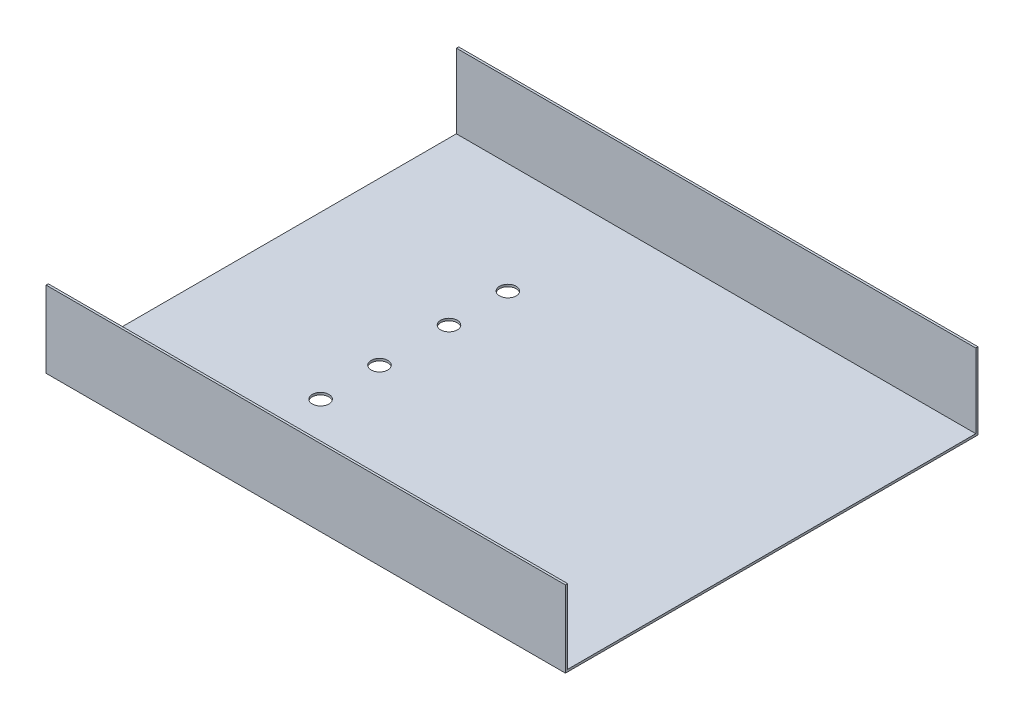
ISO-10303-21;
HEADER;
FILE_DESCRIPTION(('STEP AP214'),'2;1');
FILE_NAME('part.step','',(''),(''),'','','');
FILE_SCHEMA(('AUTOMOTIVE_DESIGN { 1 0 10303 214 1 1 1 1 }'));
ENDSEC;
DATA;
#1=APPLICATION_CONTEXT('core data for automotive mechanical design processes');
#2=APPLICATION_PROTOCOL_DEFINITION('international standard','automotive_design',2000,#1);
#3=PRODUCT_CONTEXT('',#1,'mechanical');
#4=PRODUCT('Part','Part','',(#3));
#5=PRODUCT_RELATED_PRODUCT_CATEGORY('part','',(#4));
#6=PRODUCT_DEFINITION_FORMATION('','',#4);
#7=PRODUCT_DEFINITION_CONTEXT('part definition',#1,'design');
#8=PRODUCT_DEFINITION('design','',#6,#7);
#9=PRODUCT_DEFINITION_SHAPE('','',#8);
#10=(LENGTH_UNIT() NAMED_UNIT(*) SI_UNIT(.MILLI.,.METRE.));
#11=(NAMED_UNIT(*) PLANE_ANGLE_UNIT() SI_UNIT($,.RADIAN.));
#12=(NAMED_UNIT(*) SI_UNIT($,.STERADIAN.) SOLID_ANGLE_UNIT());
#13=UNCERTAINTY_MEASURE_WITH_UNIT(LENGTH_MEASURE(1.E-05),#10,'distance_accuracy_value','');
#14=(GEOMETRIC_REPRESENTATION_CONTEXT(3) GLOBAL_UNCERTAINTY_ASSIGNED_CONTEXT((#13)) GLOBAL_UNIT_ASSIGNED_CONTEXT((#10,
#11,#12)) REPRESENTATION_CONTEXT('',''));
#15=CARTESIAN_POINT('',(0.,0.,0.));
#16=DIRECTION('',(0.,0.,1.));
#17=DIRECTION('',(1.,0.,0.));
#18=AXIS2_PLACEMENT_3D('',#15,#16,#17);
#19=CARTESIAN_POINT('',(140.,20.,0.));
#20=DIRECTION('',(0.,-1.,0.));
#21=DIRECTION('',(0.,0.,-1.));
#22=AXIS2_PLACEMENT_3D('',#19,#20,#21);
#23=PLANE('',#22);
#24=DIRECTION('',(-1.,0.,0.));
#25=VECTOR('',#24,1.);
#26=CARTESIAN_POINT('',(140.,20.,-110.));
#27=LINE('',#26,#25);
#28=CARTESIAN_POINT('',(140.,20.,-110.));
#29=VERTEX_POINT('',#28);
#30=CARTESIAN_POINT('',(0.,20.,-110.));
#31=VERTEX_POINT('',#30);
#32=EDGE_CURVE('E165',#29,#31,#27,.T.);
#33=ORIENTED_EDGE('',*,*,#32,.F.);
#34=DIRECTION('',(0.,0.,1.));
#35=VECTOR('',#34,1.);
#36=CARTESIAN_POINT('',(140.,20.,0.));
#37=LINE('',#36,#35);
#38=CARTESIAN_POINT('',(140.,20.,-110.6));
#39=VERTEX_POINT('',#38);
#40=EDGE_CURVE('E117',#39,#29,#37,.T.);
#41=ORIENTED_EDGE('',*,*,#40,.F.);
#42=DIRECTION('',(-1.,0.,0.));
#43=VECTOR('',#42,1.);
#44=CARTESIAN_POINT('',(140.,20.,-110.6));
#45=LINE('',#44,#43);
#46=CARTESIAN_POINT('',(0.,20.,-110.6));
#47=VERTEX_POINT('',#46);
#48=EDGE_CURVE('E127',#39,#47,#45,.T.);
#49=ORIENTED_EDGE('',*,*,#48,.T.);
#50=DIRECTION('',(0.,0.,1.));
#51=VECTOR('',#50,1.);
#52=CARTESIAN_POINT('',(0.,20.,0.));
#53=LINE('',#52,#51);
#54=EDGE_CURVE('E180',#47,#31,#53,.T.);
#55=ORIENTED_EDGE('',*,*,#54,.T.);
#56=EDGE_LOOP('',(#33,#41,#49,#55));
#57=FACE_BOUND('',#56,.T.);
#58=ADVANCED_FACE('F45',(#57),#23,.F.);
#59=CARTESIAN_POINT('',(140.,20.,0.));
#60=VERTEX_POINT('',#59);
#61=CARTESIAN_POINT('',(140.,20.,0.599999999999999));
#62=VERTEX_POINT('',#61);
#63=EDGE_CURVE('E116',#60,#62,#37,.T.);
#64=ORIENTED_EDGE('',*,*,#63,.F.);
#65=DIRECTION('',(-1.,0.,0.));
#66=VECTOR('',#65,1.);
#67=CARTESIAN_POINT('',(140.,20.,0.));
#68=LINE('',#67,#66);
#69=CARTESIAN_POINT('',(0.,20.,0.));
#70=VERTEX_POINT('',#69);
#71=EDGE_CURVE('E177',#60,#70,#68,.T.);
#72=ORIENTED_EDGE('',*,*,#71,.T.);
#73=CARTESIAN_POINT('',(0.,20.,0.599999999999999));
#74=VERTEX_POINT('',#73);
#75=EDGE_CURVE('E98',#70,#74,#53,.T.);
#76=ORIENTED_EDGE('',*,*,#75,.T.);
#77=DIRECTION('',(-1.,0.,0.));
#78=VECTOR('',#77,1.);
#79=CARTESIAN_POINT('',(140.,20.,0.599999999999999));
#80=LINE('',#79,#78);
#81=EDGE_CURVE('E13',#62,#74,#80,.T.);
#82=ORIENTED_EDGE('',*,*,#81,.F.);
#83=EDGE_LOOP('',(#64,#72,#76,#82));
#84=FACE_BOUND('',#83,.T.);
#85=ADVANCED_FACE('F211',(#84),#23,.F.);
#86=CARTESIAN_POINT('',(140.,20.,0.599999999999999));
#87=DIRECTION('',(0.,0.,-1.));
#88=DIRECTION('',(0.,1.,0.));
#89=AXIS2_PLACEMENT_3D('',#86,#87,#88);
#90=PLANE('',#89);
#91=DIRECTION('',(0.,-1.,0.));
#92=VECTOR('',#91,1.);
#93=CARTESIAN_POINT('',(0.,20.,0.599999999999999));
#94=LINE('',#93,#92);
#95=CARTESIAN_POINT('',(0.,-0.6,0.6));
#96=VERTEX_POINT('',#95);
#97=EDGE_CURVE('E89',#74,#96,#94,.T.);
#98=ORIENTED_EDGE('',*,*,#97,.T.);
#99=DIRECTION('',(-1.,0.,0.));
#100=VECTOR('',#99,1.);
#101=CARTESIAN_POINT('',(140.,-0.6,0.6));
#102=LINE('',#101,#100);
#103=CARTESIAN_POINT('',(140.,-0.6,0.6));
#104=VERTEX_POINT('',#103);
#105=EDGE_CURVE('E54',#104,#96,#102,.T.);
#106=ORIENTED_EDGE('',*,*,#105,.F.);
#107=DIRECTION('',(0.,-1.,0.));
#108=VECTOR('',#107,1.);
#109=CARTESIAN_POINT('',(140.,20.,0.599999999999999));
#110=LINE('',#109,#108);
#111=EDGE_CURVE('E109',#62,#104,#110,.T.);
#112=ORIENTED_EDGE('',*,*,#111,.F.);
#113=ORIENTED_EDGE('',*,*,#81,.T.);
#114=EDGE_LOOP('',(#98,#106,#112,#113));
#115=FACE_BOUND('',#114,.T.);
#116=ADVANCED_FACE('F119',(#115),#90,.F.);
#117=CARTESIAN_POINT('',(140.,-0.6,0.));
#118=DIRECTION('',(0.,1.,0.));
#119=DIRECTION('',(0.,0.,1.));
#120=AXIS2_PLACEMENT_3D('',#117,#118,#119);
#121=PLANE('',#120);
#122=CARTESIAN_POINT('',(43.65,-0.600000000000113,-80.2375000000001));
#123=DIRECTION('',(0.,1.,0.));
#124=DIRECTION('',(0.,0.,1.));
#125=AXIS2_PLACEMENT_3D('',#122,#123,#124);
#126=CIRCLE('',#125,2.24999999999999);
#127=CARTESIAN_POINT('',(43.65,-0.600000000000121,-77.9875000000001));
#128=VERTEX_POINT('',#127);
#129=EDGE_CURVE('E229',#128,#128,#126,.T.);
#130=ORIENTED_EDGE('',*,*,#129,.T.);
#131=EDGE_LOOP('',(#130));
#132=FACE_BOUND('',#131,.T.);
#133=CARTESIAN_POINT('',(43.65,-0.60000000000017,-64.3625000000001));
#134=DIRECTION('',(0.,1.,0.));
#135=DIRECTION('',(0.,0.,1.));
#136=AXIS2_PLACEMENT_3D('',#133,#134,#135);
#137=CIRCLE('',#136,2.24999999999999);
#138=CARTESIAN_POINT('',(43.65,-0.600000000000178,-62.1125000000001));
#139=VERTEX_POINT('',#138);
#140=EDGE_CURVE('E149',#139,#139,#137,.T.);
#141=ORIENTED_EDGE('',*,*,#140,.T.);
#142=EDGE_LOOP('',(#141));
#143=FACE_BOUND('',#142,.T.);
#144=CARTESIAN_POINT('',(43.65,-0.600000000000238,-45.6375000000001));
#145=DIRECTION('',(0.,1.,0.));
#146=DIRECTION('',(0.,0.,1.));
#147=AXIS2_PLACEMENT_3D('',#144,#145,#146);
#148=CIRCLE('',#147,2.24999999999999);
#149=CARTESIAN_POINT('',(43.65,-0.600000000000246,-43.3875000000001));
#150=VERTEX_POINT('',#149);
#151=EDGE_CURVE('E138',#150,#150,#148,.T.);
#152=ORIENTED_EDGE('',*,*,#151,.T.);
#153=EDGE_LOOP('',(#152));
#154=FACE_BOUND('',#153,.T.);
#155=CARTESIAN_POINT('',(43.65,-0.600000000000295,-29.7625000000001));
#156=DIRECTION('',(0.,1.,0.));
#157=DIRECTION('',(0.,0.,1.));
#158=AXIS2_PLACEMENT_3D('',#155,#156,#157);
#159=CIRCLE('',#158,2.24999999999999);
#160=CARTESIAN_POINT('',(43.65,-0.600000000000304,-27.5125000000001));
#161=VERTEX_POINT('',#160);
#162=EDGE_CURVE('E137',#161,#161,#159,.T.);
#163=ORIENTED_EDGE('',*,*,#162,.T.);
#164=EDGE_LOOP('',(#163));
#165=FACE_BOUND('',#164,.T.);
#166=DIRECTION('',(0.,0.,-1.));
#167=VECTOR('',#166,1.);
#168=CARTESIAN_POINT('',(0.,-0.6,0.));
#169=LINE('',#168,#167);
#170=CARTESIAN_POINT('',(0.,-0.6,-110.6));
#171=VERTEX_POINT('',#170);
#172=EDGE_CURVE('E134',#96,#171,#169,.T.);
#173=ORIENTED_EDGE('',*,*,#172,.T.);
#174=DIRECTION('',(-1.,0.,0.));
#175=VECTOR('',#174,1.);
#176=CARTESIAN_POINT('',(140.,-0.6,-110.6));
#177=LINE('',#176,#175);
#178=CARTESIAN_POINT('',(140.,-0.6,-110.6));
#179=VERTEX_POINT('',#178);
#180=EDGE_CURVE('E122',#179,#171,#177,.T.);
#181=ORIENTED_EDGE('',*,*,#180,.F.);
#182=DIRECTION('',(0.,0.,-1.));
#183=VECTOR('',#182,1.);
#184=CARTESIAN_POINT('',(140.,-0.6,0.));
#185=LINE('',#184,#183);
#186=EDGE_CURVE('E113',#104,#179,#185,.T.);
#187=ORIENTED_EDGE('',*,*,#186,.F.);
#188=ORIENTED_EDGE('',*,*,#105,.T.);
#189=EDGE_LOOP('',(#173,#181,#187,#188));
#190=FACE_BOUND('',#189,.T.);
#191=ADVANCED_FACE('F124',(#132,#143,#154,#165,#190),#121,.F.);
#192=CARTESIAN_POINT('',(140.,0.,-110.6));
#193=DIRECTION('',(0.,0.,1.));
#194=DIRECTION('',(1.,0.,0.));
#195=AXIS2_PLACEMENT_3D('',#192,#193,#194);
#196=PLANE('',#195);
#197=DIRECTION('',(0.,1.,0.));
#198=VECTOR('',#197,1.);
#199=CARTESIAN_POINT('',(0.,0.,-110.6));
#200=LINE('',#199,#198);
#201=EDGE_CURVE('E132',#171,#47,#200,.T.);
#202=ORIENTED_EDGE('',*,*,#201,.T.);
#203=ORIENTED_EDGE('',*,*,#48,.F.);
#204=DIRECTION('',(0.,1.,0.));
#205=VECTOR('',#204,1.);
#206=CARTESIAN_POINT('',(140.,0.,-110.6));
#207=LINE('',#206,#205);
#208=EDGE_CURVE('E71',#179,#39,#207,.T.);
#209=ORIENTED_EDGE('',*,*,#208,.F.);
#210=ORIENTED_EDGE('',*,*,#180,.T.);
#211=EDGE_LOOP('',(#202,#203,#209,#210));
#212=FACE_BOUND('',#211,.T.);
#213=ADVANCED_FACE('F47',(#212),#196,.F.);
#214=CARTESIAN_POINT('',(140.,0.,0.));
#215=DIRECTION('',(1.,0.,0.));
#216=DIRECTION('',(0.,0.,-1.));
#217=AXIS2_PLACEMENT_3D('',#214,#215,#216);
#218=PLANE('',#217);
#219=DIRECTION('',(0.,-1.,0.));
#220=VECTOR('',#219,1.);
#221=CARTESIAN_POINT('',(140.,20.,0.));
#222=LINE('',#221,#220);
#223=CARTESIAN_POINT('',(140.,0.,0.));
#224=VERTEX_POINT('',#223);
#225=EDGE_CURVE('E156',#60,#224,#222,.T.);
#226=ORIENTED_EDGE('',*,*,#225,.F.);
#227=ORIENTED_EDGE('',*,*,#63,.T.);
#228=ORIENTED_EDGE('',*,*,#111,.T.);
#229=ORIENTED_EDGE('',*,*,#186,.T.);
#230=ORIENTED_EDGE('',*,*,#208,.T.);
#231=ORIENTED_EDGE('',*,*,#40,.T.);
#232=DIRECTION('',(0.,1.,0.));
#233=VECTOR('',#232,1.);
#234=CARTESIAN_POINT('',(140.,0.,-110.));
#235=LINE('',#234,#233);
#236=CARTESIAN_POINT('',(140.,0.,-110.));
#237=VERTEX_POINT('',#236);
#238=EDGE_CURVE('E163',#237,#29,#235,.T.);
#239=ORIENTED_EDGE('',*,*,#238,.F.);
#240=DIRECTION('',(0.,0.,-1.));
#241=VECTOR('',#240,1.);
#242=CARTESIAN_POINT('',(140.,0.,0.));
#243=LINE('',#242,#241);
#244=EDGE_CURVE('E159',#224,#237,#243,.T.);
#245=ORIENTED_EDGE('',*,*,#244,.F.);
#246=EDGE_LOOP('',(#226,#227,#228,#229,#230,#231,#239,#245));
#247=FACE_BOUND('',#246,.T.);
#248=ADVANCED_FACE('F111',(#247),#218,.T.);
#249=CARTESIAN_POINT('',(0.,0.,0.));
#250=DIRECTION('',(1.,0.,0.));
#251=DIRECTION('',(0.,0.,-1.));
#252=AXIS2_PLACEMENT_3D('',#249,#250,#251);
#253=PLANE('',#252);
#254=DIRECTION('',(0.,0.,-1.));
#255=VECTOR('',#254,1.);
#256=CARTESIAN_POINT('',(0.,0.,0.));
#257=LINE('',#256,#255);
#258=CARTESIAN_POINT('',(0.,0.,0.));
#259=VERTEX_POINT('',#258);
#260=CARTESIAN_POINT('',(0.,0.,-110.));
#261=VERTEX_POINT('',#260);
#262=EDGE_CURVE('E62',#259,#261,#257,.T.);
#263=ORIENTED_EDGE('',*,*,#262,.T.);
#264=DIRECTION('',(0.,1.,0.));
#265=VECTOR('',#264,1.);
#266=CARTESIAN_POINT('',(0.,0.,-110.));
#267=LINE('',#266,#265);
#268=EDGE_CURVE('E160',#261,#31,#267,.T.);
#269=ORIENTED_EDGE('',*,*,#268,.T.);
#270=ORIENTED_EDGE('',*,*,#54,.F.);
#271=ORIENTED_EDGE('',*,*,#201,.F.);
#272=ORIENTED_EDGE('',*,*,#172,.F.);
#273=ORIENTED_EDGE('',*,*,#97,.F.);
#274=ORIENTED_EDGE('',*,*,#75,.F.);
#275=DIRECTION('',(0.,-1.,0.));
#276=VECTOR('',#275,1.);
#277=CARTESIAN_POINT('',(0.,20.,0.));
#278=LINE('',#277,#276);
#279=EDGE_CURVE('E155',#70,#259,#278,.T.);
#280=ORIENTED_EDGE('',*,*,#279,.T.);
#281=EDGE_LOOP('',(#263,#269,#270,#271,#272,#273,#274,#280));
#282=FACE_BOUND('',#281,.T.);
#283=ADVANCED_FACE('F188',(#282),#253,.F.);
#284=CARTESIAN_POINT('',(140.,20.,0.));
#285=DIRECTION('',(0.,0.,-1.));
#286=DIRECTION('',(0.,1.,0.));
#287=AXIS2_PLACEMENT_3D('',#284,#285,#286);
#288=PLANE('',#287);
#289=ORIENTED_EDGE('',*,*,#279,.F.);
#290=ORIENTED_EDGE('',*,*,#71,.F.);
#291=ORIENTED_EDGE('',*,*,#225,.T.);
#292=DIRECTION('',(-1.,0.,0.));
#293=VECTOR('',#292,1.);
#294=CARTESIAN_POINT('',(140.,0.,0.));
#295=LINE('',#294,#293);
#296=EDGE_CURVE('E175',#224,#259,#295,.T.);
#297=ORIENTED_EDGE('',*,*,#296,.T.);
#298=EDGE_LOOP('',(#289,#290,#291,#297));
#299=FACE_BOUND('',#298,.T.);
#300=ADVANCED_FACE('F206',(#299),#288,.T.);
#301=CARTESIAN_POINT('',(140.,0.,0.));
#302=DIRECTION('',(0.,1.,0.));
#303=DIRECTION('',(0.,0.,1.));
#304=AXIS2_PLACEMENT_3D('',#301,#302,#303);
#305=PLANE('',#304);
#306=CARTESIAN_POINT('',(43.65,0.,-80.2375000000001));
#307=DIRECTION('',(0.,1.,0.));
#308=DIRECTION('',(0.,0.,1.));
#309=AXIS2_PLACEMENT_3D('',#306,#307,#308);
#310=CIRCLE('',#309,2.24999999999999);
#311=CARTESIAN_POINT('',(43.65,0.,-77.9875000000001));
#312=VERTEX_POINT('',#311);
#313=EDGE_CURVE('E319',#312,#312,#310,.T.);
#314=ORIENTED_EDGE('',*,*,#313,.F.);
#315=EDGE_LOOP('',(#314));
#316=FACE_BOUND('',#315,.T.);
#317=CARTESIAN_POINT('',(43.65,0.,-64.3625000000001));
#318=DIRECTION('',(0.,1.,0.));
#319=DIRECTION('',(0.,0.,1.));
#320=AXIS2_PLACEMENT_3D('',#317,#318,#319);
#321=CIRCLE('',#320,2.24999999999999);
#322=CARTESIAN_POINT('',(43.65,0.,-62.1125000000001));
#323=VERTEX_POINT('',#322);
#324=EDGE_CURVE('E49',#323,#323,#321,.T.);
#325=ORIENTED_EDGE('',*,*,#324,.F.);
#326=EDGE_LOOP('',(#325));
#327=FACE_BOUND('',#326,.T.);
#328=CARTESIAN_POINT('',(43.65,0.,-45.6375000000001));
#329=DIRECTION('',(0.,1.,0.));
#330=DIRECTION('',(0.,0.,1.));
#331=AXIS2_PLACEMENT_3D('',#328,#329,#330);
#332=CIRCLE('',#331,2.24999999999999);
#333=CARTESIAN_POINT('',(43.65,0.,-43.3875000000001));
#334=VERTEX_POINT('',#333);
#335=EDGE_CURVE('E135',#334,#334,#332,.T.);
#336=ORIENTED_EDGE('',*,*,#335,.F.);
#337=EDGE_LOOP('',(#336));
#338=FACE_BOUND('',#337,.T.);
#339=CARTESIAN_POINT('',(43.65,0.,-29.7625000000001));
#340=DIRECTION('',(0.,1.,0.));
#341=DIRECTION('',(0.,0.,1.));
#342=AXIS2_PLACEMENT_3D('',#339,#340,#341);
#343=CIRCLE('',#342,2.24999999999999);
#344=CARTESIAN_POINT('',(43.65,0.,-27.5125000000001));
#345=VERTEX_POINT('',#344);
#346=EDGE_CURVE('E142',#345,#345,#343,.T.);
#347=ORIENTED_EDGE('',*,*,#346,.F.);
#348=EDGE_LOOP('',(#347));
#349=FACE_BOUND('',#348,.T.);
#350=ORIENTED_EDGE('',*,*,#262,.F.);
#351=ORIENTED_EDGE('',*,*,#296,.F.);
#352=ORIENTED_EDGE('',*,*,#244,.T.);
#353=DIRECTION('',(-1.,0.,0.));
#354=VECTOR('',#353,1.);
#355=CARTESIAN_POINT('',(140.,0.,-110.));
#356=LINE('',#355,#354);
#357=EDGE_CURVE('E173',#237,#261,#356,.T.);
#358=ORIENTED_EDGE('',*,*,#357,.T.);
#359=EDGE_LOOP('',(#350,#351,#352,#358));
#360=FACE_BOUND('',#359,.T.);
#361=ADVANCED_FACE('F208',(#316,#327,#338,#349,#360),#305,.T.);
#362=CARTESIAN_POINT('',(140.,0.,-110.));
#363=DIRECTION('',(0.,0.,1.));
#364=DIRECTION('',(1.,0.,0.));
#365=AXIS2_PLACEMENT_3D('',#362,#363,#364);
#366=PLANE('',#365);
#367=ORIENTED_EDGE('',*,*,#268,.F.);
#368=ORIENTED_EDGE('',*,*,#357,.F.);
#369=ORIENTED_EDGE('',*,*,#238,.T.);
#370=ORIENTED_EDGE('',*,*,#32,.T.);
#371=EDGE_LOOP('',(#367,#368,#369,#370));
#372=FACE_BOUND('',#371,.T.);
#373=ADVANCED_FACE('F210',(#372),#366,.T.);
#374=CARTESIAN_POINT('',(43.65,0.999999999999237,-29.7625000000001));
#375=DIRECTION('',(0.,1.,0.));
#376=DIRECTION('',(0.,0.,1.));
#377=AXIS2_PLACEMENT_3D('',#374,#375,#376);
#378=CYLINDRICAL_SURFACE('',#377,2.24999999999999);
#379=ORIENTED_EDGE('',*,*,#346,.T.);
#380=EDGE_LOOP('',(#379));
#381=FACE_BOUND('',#380,.T.);
#382=ORIENTED_EDGE('',*,*,#162,.F.);
#383=EDGE_LOOP('',(#382));
#384=FACE_BOUND('',#383,.T.);
#385=ADVANCED_FACE('F235',(#381,#384),#378,.F.);
#386=CARTESIAN_POINT('',(43.65,0.999999999999294,-45.6375000000001));
#387=DIRECTION('',(0.,1.,0.));
#388=DIRECTION('',(0.,0.,1.));
#389=AXIS2_PLACEMENT_3D('',#386,#387,#388);
#390=CYLINDRICAL_SURFACE('',#389,2.24999999999999);
#391=ORIENTED_EDGE('',*,*,#335,.T.);
#392=EDGE_LOOP('',(#391));
#393=FACE_BOUND('',#392,.T.);
#394=ORIENTED_EDGE('',*,*,#151,.F.);
#395=EDGE_LOOP('',(#394));
#396=FACE_BOUND('',#395,.T.);
#397=ADVANCED_FACE('F237',(#393,#396),#390,.F.);
#398=CARTESIAN_POINT('',(43.65,0.999999999999362,-64.3625000000001));
#399=DIRECTION('',(0.,1.,0.));
#400=DIRECTION('',(0.,0.,1.));
#401=AXIS2_PLACEMENT_3D('',#398,#399,#400);
#402=CYLINDRICAL_SURFACE('',#401,2.24999999999999);
#403=ORIENTED_EDGE('',*,*,#324,.T.);
#404=EDGE_LOOP('',(#403));
#405=FACE_BOUND('',#404,.T.);
#406=ORIENTED_EDGE('',*,*,#140,.F.);
#407=EDGE_LOOP('',(#406));
#408=FACE_BOUND('',#407,.T.);
#409=ADVANCED_FACE('F244',(#405,#408),#402,.F.);
#410=CARTESIAN_POINT('',(43.65,0.999999999999419,-80.2375000000001));
#411=DIRECTION('',(0.,1.,0.));
#412=DIRECTION('',(0.,0.,1.));
#413=AXIS2_PLACEMENT_3D('',#410,#411,#412);
#414=CYLINDRICAL_SURFACE('',#413,2.24999999999999);
#415=ORIENTED_EDGE('',*,*,#313,.T.);
#416=EDGE_LOOP('',(#415));
#417=FACE_BOUND('',#416,.T.);
#418=ORIENTED_EDGE('',*,*,#129,.F.);
#419=EDGE_LOOP('',(#418));
#420=FACE_BOUND('',#419,.T.);
#421=ADVANCED_FACE('F303',(#417,#420),#414,.F.);
#422=CLOSED_SHELL('',(#58,#85,#116,#191,#213,#248,#283,#300,#361,#373,#385,#397,#409,#421));
#423=MANIFOLD_SOLID_BREP('B2',#422);
#424=ADVANCED_BREP_SHAPE_REPRESENTATION('',(#18,#423),#14);
#425=SHAPE_DEFINITION_REPRESENTATION(#9,#424);
ENDSEC;
END-ISO-10303-21;
